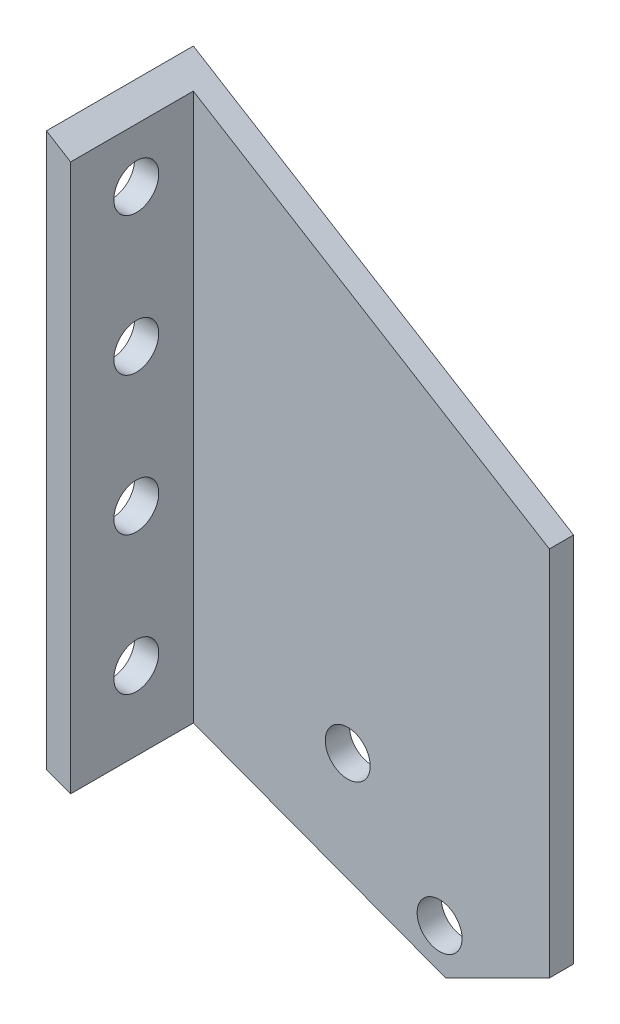
ISO-10303-21;
HEADER;
FILE_DESCRIPTION(('STEP AP214'),'2;1');
FILE_NAME('part.step','',(''),(''),'','','');
FILE_SCHEMA(('AUTOMOTIVE_DESIGN { 1 0 10303 214 1 1 1 1 }'));
ENDSEC;
DATA;
#1=APPLICATION_CONTEXT('core data for automotive mechanical design processes');
#2=APPLICATION_PROTOCOL_DEFINITION('international standard','automotive_design',2000,#1);
#3=PRODUCT_CONTEXT('',#1,'mechanical');
#4=PRODUCT('Part','Part','',(#3));
#5=PRODUCT_RELATED_PRODUCT_CATEGORY('part','',(#4));
#6=PRODUCT_DEFINITION_FORMATION('','',#4);
#7=PRODUCT_DEFINITION_CONTEXT('part definition',#1,'design');
#8=PRODUCT_DEFINITION('design','',#6,#7);
#9=PRODUCT_DEFINITION_SHAPE('','',#8);
#10=(LENGTH_UNIT() NAMED_UNIT(*) SI_UNIT(.MILLI.,.METRE.));
#11=(NAMED_UNIT(*) PLANE_ANGLE_UNIT() SI_UNIT($,.RADIAN.));
#12=(NAMED_UNIT(*) SI_UNIT($,.STERADIAN.) SOLID_ANGLE_UNIT());
#13=UNCERTAINTY_MEASURE_WITH_UNIT(LENGTH_MEASURE(1.E-05),#10,'distance_accuracy_value','');
#14=(GEOMETRIC_REPRESENTATION_CONTEXT(3) GLOBAL_UNCERTAINTY_ASSIGNED_CONTEXT((#13)) GLOBAL_UNIT_ASSIGNED_CONTEXT((#10,
#11,#12)) REPRESENTATION_CONTEXT('',''));
#15=CARTESIAN_POINT('',(0.,0.,0.));
#16=DIRECTION('',(0.,0.,1.));
#17=DIRECTION('',(1.,0.,0.));
#18=AXIS2_PLACEMENT_3D('',#15,#16,#17);
#19=CARTESIAN_POINT('',(71.4349047997445,-49.7035843559764,14.));
#20=DIRECTION('',(0.,0.,-1.));
#21=DIRECTION('',(-1.,0.,0.));
#22=AXIS2_PLACEMENT_3D('',#19,#20,#21);
#23=PLANE('',#22);
#24=CARTESIAN_POINT('',(7.92223725457086,-270.189333367656,14.));
#25=DIRECTION('',(0.,0.,1.));
#26=DIRECTION('',(1.,0.,0.));
#27=AXIS2_PLACEMENT_3D('',#24,#25,#26);
#28=CIRCLE('',#27,13.);
#29=CARTESIAN_POINT('',(20.9222372545709,-270.189333367656,14.));
#30=VERTEX_POINT('',#29);
#31=EDGE_CURVE('E132',#30,#30,#28,.T.);
#32=ORIENTED_EDGE('',*,*,#31,.F.);
#33=EDGE_LOOP('',(#32));
#34=FACE_BOUND('',#33,.T.);
#35=CARTESIAN_POINT('',(-45.2268698518229,-210.396587872963,14.));
#36=DIRECTION('',(0.,0.,1.));
#37=DIRECTION('',(1.,0.,0.));
#38=AXIS2_PLACEMENT_3D('',#35,#36,#37);
#39=CIRCLE('',#38,13.);
#40=CARTESIAN_POINT('',(-32.2268698518229,-210.396587872963,14.));
#41=VERTEX_POINT('',#40);
#42=EDGE_CURVE('E212',#41,#41,#39,.T.);
#43=ORIENTED_EDGE('',*,*,#42,.F.);
#44=EDGE_LOOP('',(#43));
#45=FACE_BOUND('',#44,.T.);
#46=DIRECTION('',(0.,1.,0.));
#47=VECTOR('',#46,1.);
#48=CARTESIAN_POINT('',(-134.565095200262,76.7055065531149,14.));
#49=LINE('',#48,#47);
#50=CARTESIAN_POINT('',(-134.565095200262,-239.953584355973,14.));
#51=VERTEX_POINT('',#50);
#52=CARTESIAN_POINT('',(-134.565095200262,76.7055065531149,14.));
#53=VERTEX_POINT('',#52);
#54=EDGE_CURVE('E51',#51,#53,#49,.T.);
#55=ORIENTED_EDGE('',*,*,#54,.F.);
#56=DIRECTION('',(0.936329177569051,-0.351123441588373,0.));
#57=VECTOR('',#56,1.);
#58=CARTESIAN_POINT('',(11.4349047997505,-294.703584355974,14.));
#59=LINE('',#58,#57);
#60=CARTESIAN_POINT('',(11.4349047997505,-294.703584355974,14.));
#61=VERTEX_POINT('',#60);
#62=EDGE_CURVE('E83',#51,#61,#59,.T.);
#63=ORIENTED_EDGE('',*,*,#62,.T.);
#64=DIRECTION('',(0.894427190999912,0.447213595499967,0.));
#65=VECTOR('',#64,1.);
#66=CARTESIAN_POINT('',(71.4349047997446,-264.703584355976,14.));
#67=LINE('',#66,#65);
#68=CARTESIAN_POINT('',(71.4349047997446,-264.703584355976,14.));
#69=VERTEX_POINT('',#68);
#70=EDGE_CURVE('E197',#61,#69,#67,.T.);
#71=ORIENTED_EDGE('',*,*,#70,.T.);
#72=DIRECTION('',(0.,1.,0.));
#73=VECTOR('',#72,1.);
#74=CARTESIAN_POINT('',(71.4349047997445,-49.7035843559763,14.));
#75=LINE('',#74,#73);
#76=CARTESIAN_POINT('',(71.4349047997445,-49.7035843559763,14.));
#77=VERTEX_POINT('',#76);
#78=EDGE_CURVE('E58',#69,#77,#75,.T.);
#79=ORIENTED_EDGE('',*,*,#78,.T.);
#80=DIRECTION('',(-0.852322728648673,0.523016219852579,0.));
#81=VECTOR('',#80,1.);
#82=CARTESIAN_POINT('',(-148.565095200262,85.2964156440237,14.));
#83=LINE('',#82,#81);
#84=EDGE_CURVE('E195',#77,#53,#83,.T.);
#85=ORIENTED_EDGE('',*,*,#84,.T.);
#86=EDGE_LOOP('',(#55,#63,#71,#79,#85));
#87=FACE_BOUND('',#86,.T.);
#88=ADVANCED_FACE('F34',(#34,#45,#87),#23,.F.);
#89=CARTESIAN_POINT('',(71.4349047997445,-49.7035843559764,0.));
#90=DIRECTION('',(0.,0.,-1.));
#91=DIRECTION('',(-1.,0.,0.));
#92=AXIS2_PLACEMENT_3D('',#89,#90,#91);
#93=PLANE('',#92);
#94=CARTESIAN_POINT('',(-45.2268698518229,-210.396587872963,0.));
#95=DIRECTION('',(0.,0.,1.));
#96=DIRECTION('',(1.,0.,0.));
#97=AXIS2_PLACEMENT_3D('',#94,#95,#96);
#98=CIRCLE('',#97,13.);
#99=CARTESIAN_POINT('',(-32.2268698518229,-210.396587872963,0.));
#100=VERTEX_POINT('',#99);
#101=EDGE_CURVE('E204',#100,#100,#98,.T.);
#102=ORIENTED_EDGE('',*,*,#101,.T.);
#103=EDGE_LOOP('',(#102));
#104=FACE_BOUND('',#103,.T.);
#105=DIRECTION('',(-0.852322728648673,0.523016219852579,0.));
#106=VECTOR('',#105,1.);
#107=CARTESIAN_POINT('',(-148.565095200262,85.2964156440237,0.));
#108=LINE('',#107,#106);
#109=CARTESIAN_POINT('',(71.4349047997445,-49.7035843559763,0.));
#110=VERTEX_POINT('',#109);
#111=CARTESIAN_POINT('',(-148.565095200262,85.2964156440237,0.));
#112=VERTEX_POINT('',#111);
#113=EDGE_CURVE('E106',#110,#112,#108,.T.);
#114=ORIENTED_EDGE('',*,*,#113,.F.);
#115=DIRECTION('',(0.,1.,0.));
#116=VECTOR('',#115,1.);
#117=CARTESIAN_POINT('',(71.4349047997445,-49.7035843559763,0.));
#118=LINE('',#117,#116);
#119=CARTESIAN_POINT('',(71.4349047997446,-264.703584355976,0.));
#120=VERTEX_POINT('',#119);
#121=EDGE_CURVE('E81',#120,#110,#118,.T.);
#122=ORIENTED_EDGE('',*,*,#121,.F.);
#123=DIRECTION('',(0.894427190999912,0.447213595499967,0.));
#124=VECTOR('',#123,1.);
#125=CARTESIAN_POINT('',(71.4349047997446,-264.703584355976,0.));
#126=LINE('',#125,#124);
#127=CARTESIAN_POINT('',(11.4349047997505,-294.703584355974,0.));
#128=VERTEX_POINT('',#127);
#129=EDGE_CURVE('E198',#128,#120,#126,.T.);
#130=ORIENTED_EDGE('',*,*,#129,.F.);
#131=DIRECTION('',(0.936329177569051,-0.351123441588373,0.));
#132=VECTOR('',#131,1.);
#133=CARTESIAN_POINT('',(11.4349047997505,-294.703584355974,0.));
#134=LINE('',#133,#132);
#135=CARTESIAN_POINT('',(-148.565095200262,-234.703584355973,0.));
#136=VERTEX_POINT('',#135);
#137=EDGE_CURVE('E214',#136,#128,#134,.T.);
#138=ORIENTED_EDGE('',*,*,#137,.F.);
#139=DIRECTION('',(0.,-1.,0.));
#140=VECTOR('',#139,1.);
#141=CARTESIAN_POINT('',(-148.565095200262,-234.703584355973,0.));
#142=LINE('',#141,#140);
#143=EDGE_CURVE('E211',#112,#136,#142,.T.);
#144=ORIENTED_EDGE('',*,*,#143,.F.);
#145=EDGE_LOOP('',(#114,#122,#130,#138,#144));
#146=FACE_BOUND('',#145,.T.);
#147=CARTESIAN_POINT('',(7.92223725457086,-270.189333367656,0.));
#148=DIRECTION('',(0.,0.,1.));
#149=DIRECTION('',(1.,0.,0.));
#150=AXIS2_PLACEMENT_3D('',#147,#148,#149);
#151=CIRCLE('',#150,13.);
#152=CARTESIAN_POINT('',(20.9222372545709,-270.189333367656,0.));
#153=VERTEX_POINT('',#152);
#154=EDGE_CURVE('E144',#153,#153,#151,.T.);
#155=ORIENTED_EDGE('',*,*,#154,.T.);
#156=EDGE_LOOP('',(#155));
#157=FACE_BOUND('',#156,.T.);
#158=ADVANCED_FACE('F226',(#104,#146,#157),#93,.T.);
#159=CARTESIAN_POINT('',(-148.565095200262,85.2964156440237,14.));
#160=DIRECTION('',(-0.523016219852579,-0.852322728648673,0.));
#161=DIRECTION('',(0.852322728648673,-0.523016219852579,0.));
#162=AXIS2_PLACEMENT_3D('',#159,#160,#161);
#163=PLANE('',#162);
#164=ORIENTED_EDGE('',*,*,#113,.T.);
#165=DIRECTION('',(0.,0.,-1.));
#166=VECTOR('',#165,1.);
#167=CARTESIAN_POINT('',(-148.565095200262,85.2964156440237,14.));
#168=LINE('',#167,#166);
#169=CARTESIAN_POINT('',(-148.565095200262,85.2964156440237,85.));
#170=VERTEX_POINT('',#169);
#171=EDGE_CURVE('E11',#170,#112,#168,.T.);
#172=ORIENTED_EDGE('',*,*,#171,.F.);
#173=DIRECTION('',(-0.852322728648673,0.523016219852578,0.));
#174=VECTOR('',#173,1.);
#175=CARTESIAN_POINT('',(-134.565095200262,76.7055065531149,85.));
#176=LINE('',#175,#174);
#177=CARTESIAN_POINT('',(-134.565095200262,76.7055065531149,85.));
#178=VERTEX_POINT('',#177);
#179=EDGE_CURVE('E104',#178,#170,#176,.T.);
#180=ORIENTED_EDGE('',*,*,#179,.F.);
#181=DIRECTION('',(0.,0.,-1.));
#182=VECTOR('',#181,1.);
#183=CARTESIAN_POINT('',(-134.565095200262,76.7055065531149,85.));
#184=LINE('',#183,#182);
#185=EDGE_CURVE('E129',#178,#53,#184,.T.);
#186=ORIENTED_EDGE('',*,*,#185,.T.);
#187=ORIENTED_EDGE('',*,*,#84,.F.);
#188=DIRECTION('',(0.,0.,-1.));
#189=VECTOR('',#188,1.);
#190=CARTESIAN_POINT('',(71.4349047997445,-49.7035843559763,14.));
#191=LINE('',#190,#189);
#192=EDGE_CURVE('E196',#77,#110,#191,.T.);
#193=ORIENTED_EDGE('',*,*,#192,.T.);
#194=EDGE_LOOP('',(#164,#172,#180,#186,#187,#193));
#195=FACE_BOUND('',#194,.T.);
#196=ADVANCED_FACE('F36',(#195),#163,.F.);
#197=CARTESIAN_POINT('',(-148.565095200262,-234.703584355973,14.));
#198=DIRECTION('',(1.,0.,0.));
#199=DIRECTION('',(0.,0.,-1.));
#200=AXIS2_PLACEMENT_3D('',#197,#198,#199);
#201=PLANE('',#200);
#202=CARTESIAN_POINT('',(-148.565095200262,-194.703584355972,47.));
#203=DIRECTION('',(-1.,0.,0.));
#204=DIRECTION('',(0.,0.,1.));
#205=AXIS2_PLACEMENT_3D('',#202,#203,#204);
#206=CIRCLE('',#205,13.);
#207=CARTESIAN_POINT('',(-148.565095200262,-194.703584355972,60.));
#208=VERTEX_POINT('',#207);
#209=EDGE_CURVE('E163',#208,#208,#206,.T.);
#210=ORIENTED_EDGE('',*,*,#209,.F.);
#211=EDGE_LOOP('',(#210));
#212=FACE_BOUND('',#211,.T.);
#213=CARTESIAN_POINT('',(-148.565095200262,-114.703584355972,47.));
#214=DIRECTION('',(-1.,0.,0.));
#215=DIRECTION('',(0.,0.,1.));
#216=AXIS2_PLACEMENT_3D('',#213,#214,#215);
#217=CIRCLE('',#216,13.);
#218=CARTESIAN_POINT('',(-148.565095200262,-114.703584355972,60.));
#219=VERTEX_POINT('',#218);
#220=EDGE_CURVE('E154',#219,#219,#217,.T.);
#221=ORIENTED_EDGE('',*,*,#220,.F.);
#222=EDGE_LOOP('',(#221));
#223=FACE_BOUND('',#222,.T.);
#224=CARTESIAN_POINT('',(-148.565095200262,-34.7035843559723,47.));
#225=DIRECTION('',(-1.,0.,0.));
#226=DIRECTION('',(0.,0.,1.));
#227=AXIS2_PLACEMENT_3D('',#224,#225,#226);
#228=CIRCLE('',#227,13.);
#229=CARTESIAN_POINT('',(-148.565095200262,-34.7035843559723,60.));
#230=VERTEX_POINT('',#229);
#231=EDGE_CURVE('E151',#230,#230,#228,.T.);
#232=ORIENTED_EDGE('',*,*,#231,.F.);
#233=EDGE_LOOP('',(#232));
#234=FACE_BOUND('',#233,.T.);
#235=CARTESIAN_POINT('',(-148.565095200262,45.2964156440277,47.));
#236=DIRECTION('',(-1.,0.,0.));
#237=DIRECTION('',(0.,0.,1.));
#238=AXIS2_PLACEMENT_3D('',#235,#236,#237);
#239=CIRCLE('',#238,13.);
#240=CARTESIAN_POINT('',(-148.565095200262,45.2964156440277,60.));
#241=VERTEX_POINT('',#240);
#242=EDGE_CURVE('E124',#241,#241,#239,.T.);
#243=ORIENTED_EDGE('',*,*,#242,.F.);
#244=EDGE_LOOP('',(#243));
#245=FACE_BOUND('',#244,.T.);
#246=ORIENTED_EDGE('',*,*,#143,.T.);
#247=DIRECTION('',(0.,0.,-1.));
#248=VECTOR('',#247,1.);
#249=CARTESIAN_POINT('',(-148.565095200262,-234.703584355973,14.));
#250=LINE('',#249,#248);
#251=CARTESIAN_POINT('',(-148.565095200262,-234.703584355973,85.));
#252=VERTEX_POINT('',#251);
#253=EDGE_CURVE('E43',#252,#136,#250,.T.);
#254=ORIENTED_EDGE('',*,*,#253,.F.);
#255=DIRECTION('',(0.,-1.,0.));
#256=VECTOR('',#255,1.);
#257=CARTESIAN_POINT('',(-148.565095200262,85.2964156440237,85.));
#258=LINE('',#257,#256);
#259=EDGE_CURVE('E109',#170,#252,#258,.T.);
#260=ORIENTED_EDGE('',*,*,#259,.F.);
#261=ORIENTED_EDGE('',*,*,#171,.T.);
#262=EDGE_LOOP('',(#246,#254,#260,#261));
#263=FACE_BOUND('',#262,.T.);
#264=ADVANCED_FACE('F110',(#212,#223,#234,#245,#263),#201,.F.);
#265=CARTESIAN_POINT('',(11.4349047997505,-294.703584355974,14.));
#266=DIRECTION('',(0.351123441588373,0.936329177569051,0.));
#267=DIRECTION('',(-0.936329177569052,0.351123441588373,0.));
#268=AXIS2_PLACEMENT_3D('',#265,#266,#267);
#269=PLANE('',#268);
#270=ORIENTED_EDGE('',*,*,#137,.T.);
#271=DIRECTION('',(0.,0.,-1.));
#272=VECTOR('',#271,1.);
#273=CARTESIAN_POINT('',(11.4349047997505,-294.703584355974,14.));
#274=LINE('',#273,#272);
#275=EDGE_CURVE('E220',#61,#128,#274,.T.);
#276=ORIENTED_EDGE('',*,*,#275,.F.);
#277=ORIENTED_EDGE('',*,*,#62,.F.);
#278=DIRECTION('',(0.,0.,-1.));
#279=VECTOR('',#278,1.);
#280=CARTESIAN_POINT('',(-134.565095200262,-239.953584355973,85.));
#281=LINE('',#280,#279);
#282=CARTESIAN_POINT('',(-134.565095200262,-239.953584355973,85.));
#283=VERTEX_POINT('',#282);
#284=EDGE_CURVE('E139',#283,#51,#281,.T.);
#285=ORIENTED_EDGE('',*,*,#284,.F.);
#286=DIRECTION('',(0.936329177569052,-0.351123441588373,0.));
#287=VECTOR('',#286,1.);
#288=CARTESIAN_POINT('',(-148.565095200262,-234.703584355973,85.));
#289=LINE('',#288,#287);
#290=EDGE_CURVE('E114',#252,#283,#289,.T.);
#291=ORIENTED_EDGE('',*,*,#290,.F.);
#292=ORIENTED_EDGE('',*,*,#253,.T.);
#293=EDGE_LOOP('',(#270,#276,#277,#285,#291,#292));
#294=FACE_BOUND('',#293,.T.);
#295=ADVANCED_FACE('F173',(#294),#269,.F.);
#296=CARTESIAN_POINT('',(71.4349047997446,-264.703584355976,14.));
#297=DIRECTION('',(-0.447213595499967,0.894427190999912,0.));
#298=DIRECTION('',(-0.894427190999912,-0.447213595499967,0.));
#299=AXIS2_PLACEMENT_3D('',#296,#297,#298);
#300=PLANE('',#299);
#301=ORIENTED_EDGE('',*,*,#129,.T.);
#302=DIRECTION('',(0.,0.,-1.));
#303=VECTOR('',#302,1.);
#304=CARTESIAN_POINT('',(71.4349047997446,-264.703584355976,14.));
#305=LINE('',#304,#303);
#306=EDGE_CURVE('E218',#69,#120,#305,.T.);
#307=ORIENTED_EDGE('',*,*,#306,.F.);
#308=ORIENTED_EDGE('',*,*,#70,.F.);
#309=ORIENTED_EDGE('',*,*,#275,.T.);
#310=EDGE_LOOP('',(#301,#307,#308,#309));
#311=FACE_BOUND('',#310,.T.);
#312=ADVANCED_FACE('F230',(#311),#300,.F.);
#313=CARTESIAN_POINT('',(71.4349047997445,-49.7035843559763,14.));
#314=DIRECTION('',(-1.,0.,0.));
#315=DIRECTION('',(0.,-1.,0.));
#316=AXIS2_PLACEMENT_3D('',#313,#314,#315);
#317=PLANE('',#316);
#318=ORIENTED_EDGE('',*,*,#121,.T.);
#319=ORIENTED_EDGE('',*,*,#192,.F.);
#320=ORIENTED_EDGE('',*,*,#78,.F.);
#321=ORIENTED_EDGE('',*,*,#306,.T.);
#322=EDGE_LOOP('',(#318,#319,#320,#321));
#323=FACE_BOUND('',#322,.T.);
#324=ADVANCED_FACE('F232',(#323),#317,.F.);
#325=CARTESIAN_POINT('',(-45.2268698518229,-210.396587872963,14.));
#326=DIRECTION('',(0.,0.,-1.));
#327=DIRECTION('',(-1.,0.,0.));
#328=AXIS2_PLACEMENT_3D('',#325,#326,#327);
#329=CYLINDRICAL_SURFACE('',#328,13.);
#330=ORIENTED_EDGE('',*,*,#42,.T.);
#331=EDGE_LOOP('',(#330));
#332=FACE_BOUND('',#331,.T.);
#333=ORIENTED_EDGE('',*,*,#101,.F.);
#334=EDGE_LOOP('',(#333));
#335=FACE_BOUND('',#334,.T.);
#336=ADVANCED_FACE('F234',(#332,#335),#329,.F.);
#337=CARTESIAN_POINT('',(7.92223725457086,-270.189333367656,14.));
#338=DIRECTION('',(0.,0.,-1.));
#339=DIRECTION('',(-1.,0.,0.));
#340=AXIS2_PLACEMENT_3D('',#337,#338,#339);
#341=CYLINDRICAL_SURFACE('',#340,13.);
#342=ORIENTED_EDGE('',*,*,#31,.T.);
#343=EDGE_LOOP('',(#342));
#344=FACE_BOUND('',#343,.T.);
#345=ORIENTED_EDGE('',*,*,#154,.F.);
#346=EDGE_LOOP('',(#345));
#347=FACE_BOUND('',#346,.T.);
#348=ADVANCED_FACE('F190',(#344,#347),#341,.F.);
#349=CARTESIAN_POINT('',(-134.565095200262,76.7055065531149,85.));
#350=DIRECTION('',(-1.,0.,0.));
#351=DIRECTION('',(0.,-1.,0.));
#352=AXIS2_PLACEMENT_3D('',#349,#350,#351);
#353=PLANE('',#352);
#354=CARTESIAN_POINT('',(-134.565095200262,-194.703584355972,47.));
#355=DIRECTION('',(-1.,0.,0.));
#356=DIRECTION('',(0.,-1.,0.));
#357=AXIS2_PLACEMENT_3D('',#354,#355,#356);
#358=CIRCLE('',#357,13.);
#359=CARTESIAN_POINT('',(-134.565095200262,-207.703584355972,47.));
#360=VERTEX_POINT('',#359);
#361=EDGE_CURVE('E38',#360,#360,#358,.T.);
#362=ORIENTED_EDGE('',*,*,#361,.T.);
#363=EDGE_LOOP('',(#362));
#364=FACE_BOUND('',#363,.T.);
#365=CARTESIAN_POINT('',(-134.565095200262,-114.703584355972,47.));
#366=DIRECTION('',(-1.,0.,0.));
#367=DIRECTION('',(0.,-1.,0.));
#368=AXIS2_PLACEMENT_3D('',#365,#366,#367);
#369=CIRCLE('',#368,13.);
#370=CARTESIAN_POINT('',(-134.565095200262,-127.703584355972,47.));
#371=VERTEX_POINT('',#370);
#372=EDGE_CURVE('E152',#371,#371,#369,.T.);
#373=ORIENTED_EDGE('',*,*,#372,.T.);
#374=EDGE_LOOP('',(#373));
#375=FACE_BOUND('',#374,.T.);
#376=CARTESIAN_POINT('',(-134.565095200262,-34.7035843559723,47.));
#377=DIRECTION('',(-1.,0.,0.));
#378=DIRECTION('',(0.,-1.,0.));
#379=AXIS2_PLACEMENT_3D('',#376,#377,#378);
#380=CIRCLE('',#379,13.);
#381=CARTESIAN_POINT('',(-134.565095200262,-47.7035843559723,47.));
#382=VERTEX_POINT('',#381);
#383=EDGE_CURVE('E149',#382,#382,#380,.T.);
#384=ORIENTED_EDGE('',*,*,#383,.T.);
#385=EDGE_LOOP('',(#384));
#386=FACE_BOUND('',#385,.T.);
#387=CARTESIAN_POINT('',(-134.565095200262,45.2964156440277,47.));
#388=DIRECTION('',(-1.,0.,0.));
#389=DIRECTION('',(0.,-1.,0.));
#390=AXIS2_PLACEMENT_3D('',#387,#388,#389);
#391=CIRCLE('',#390,13.);
#392=CARTESIAN_POINT('',(-134.565095200262,32.2964156440277,47.));
#393=VERTEX_POINT('',#392);
#394=EDGE_CURVE('E121',#393,#393,#391,.T.);
#395=ORIENTED_EDGE('',*,*,#394,.T.);
#396=EDGE_LOOP('',(#395));
#397=FACE_BOUND('',#396,.T.);
#398=ORIENTED_EDGE('',*,*,#54,.T.);
#399=ORIENTED_EDGE('',*,*,#185,.F.);
#400=DIRECTION('',(0.,1.,0.));
#401=VECTOR('',#400,1.);
#402=CARTESIAN_POINT('',(-134.565095200262,76.7055065531149,85.));
#403=LINE('',#402,#401);
#404=EDGE_CURVE('E118',#283,#178,#403,.T.);
#405=ORIENTED_EDGE('',*,*,#404,.F.);
#406=ORIENTED_EDGE('',*,*,#284,.T.);
#407=EDGE_LOOP('',(#398,#399,#405,#406));
#408=FACE_BOUND('',#407,.T.);
#409=ADVANCED_FACE('F187',(#364,#375,#386,#397,#408),#353,.F.);
#410=CARTESIAN_POINT('',(-148.565095200262,85.2964156440237,85.));
#411=DIRECTION('',(0.,0.,1.));
#412=DIRECTION('',(1.,0.,0.));
#413=AXIS2_PLACEMENT_3D('',#410,#411,#412);
#414=PLANE('',#413);
#415=ORIENTED_EDGE('',*,*,#179,.T.);
#416=ORIENTED_EDGE('',*,*,#259,.T.);
#417=ORIENTED_EDGE('',*,*,#290,.T.);
#418=ORIENTED_EDGE('',*,*,#404,.T.);
#419=EDGE_LOOP('',(#415,#416,#417,#418));
#420=FACE_BOUND('',#419,.T.);
#421=ADVANCED_FACE('F116',(#420),#414,.T.);
#422=CARTESIAN_POINT('',(71.4349297997446,45.2964156440277,47.));
#423=DIRECTION('',(-1.,0.,0.));
#424=DIRECTION('',(0.,0.,1.));
#425=AXIS2_PLACEMENT_3D('',#422,#423,#424);
#426=CYLINDRICAL_SURFACE('',#425,13.);
#427=ORIENTED_EDGE('',*,*,#242,.T.);
#428=EDGE_LOOP('',(#427));
#429=FACE_BOUND('',#428,.T.);
#430=ORIENTED_EDGE('',*,*,#394,.F.);
#431=EDGE_LOOP('',(#430));
#432=FACE_BOUND('',#431,.T.);
#433=ADVANCED_FACE('F180',(#429,#432),#426,.F.);
#434=CARTESIAN_POINT('',(71.4349297997446,-34.7035843559723,47.));
#435=DIRECTION('',(-1.,0.,0.));
#436=DIRECTION('',(0.,0.,1.));
#437=AXIS2_PLACEMENT_3D('',#434,#435,#436);
#438=CYLINDRICAL_SURFACE('',#437,13.);
#439=ORIENTED_EDGE('',*,*,#231,.T.);
#440=EDGE_LOOP('',(#439));
#441=FACE_BOUND('',#440,.T.);
#442=ORIENTED_EDGE('',*,*,#383,.F.);
#443=EDGE_LOOP('',(#442));
#444=FACE_BOUND('',#443,.T.);
#445=ADVANCED_FACE('F183',(#441,#444),#438,.F.);
#446=CARTESIAN_POINT('',(71.4349297997446,-114.703584355972,47.));
#447=DIRECTION('',(-1.,0.,0.));
#448=DIRECTION('',(0.,0.,1.));
#449=AXIS2_PLACEMENT_3D('',#446,#447,#448);
#450=CYLINDRICAL_SURFACE('',#449,13.);
#451=ORIENTED_EDGE('',*,*,#220,.T.);
#452=EDGE_LOOP('',(#451));
#453=FACE_BOUND('',#452,.T.);
#454=ORIENTED_EDGE('',*,*,#372,.F.);
#455=EDGE_LOOP('',(#454));
#456=FACE_BOUND('',#455,.T.);
#457=ADVANCED_FACE('F261',(#453,#456),#450,.F.);
#458=CARTESIAN_POINT('',(71.4349297997446,-194.703584355972,47.));
#459=DIRECTION('',(-1.,0.,0.));
#460=DIRECTION('',(0.,0.,1.));
#461=AXIS2_PLACEMENT_3D('',#458,#459,#460);
#462=CYLINDRICAL_SURFACE('',#461,13.);
#463=ORIENTED_EDGE('',*,*,#209,.T.);
#464=EDGE_LOOP('',(#463));
#465=FACE_BOUND('',#464,.T.);
#466=ORIENTED_EDGE('',*,*,#361,.F.);
#467=EDGE_LOOP('',(#466));
#468=FACE_BOUND('',#467,.T.);
#469=ADVANCED_FACE('F168',(#465,#468),#462,.F.);
#470=CLOSED_SHELL('',(#88,#158,#196,#264,#295,#312,#324,#336,#348,#409,#421,#433,#445,#457,#469));
#471=MANIFOLD_SOLID_BREP('B2',#470);
#472=ADVANCED_BREP_SHAPE_REPRESENTATION('',(#18,#471),#14);
#473=SHAPE_DEFINITION_REPRESENTATION(#9,#472);
ENDSEC;
END-ISO-10303-21;
